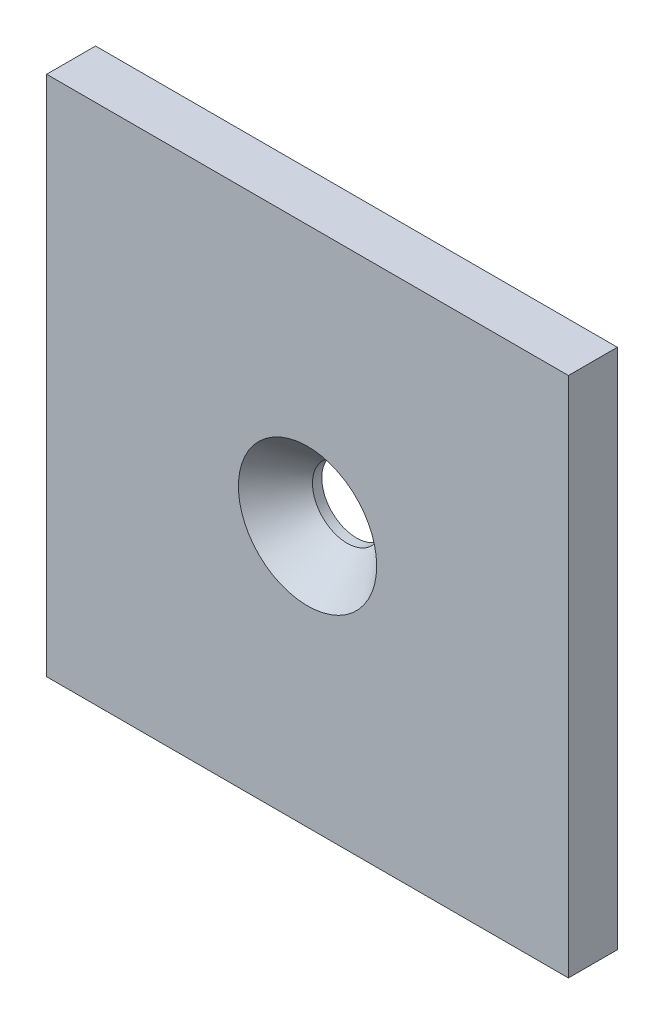
ISO-10303-21;
HEADER;
FILE_DESCRIPTION(('STEP AP214'),'2;1');
FILE_NAME('part.step','',(''),(''),'','','');
FILE_SCHEMA(('AUTOMOTIVE_DESIGN { 1 0 10303 214 1 1 1 1 }'));
ENDSEC;
DATA;
#1=APPLICATION_CONTEXT('core data for automotive mechanical design processes');
#2=APPLICATION_PROTOCOL_DEFINITION('international standard','automotive_design',2000,#1);
#3=PRODUCT_CONTEXT('',#1,'mechanical');
#4=PRODUCT('Part','Part','',(#3));
#5=PRODUCT_RELATED_PRODUCT_CATEGORY('part','',(#4));
#6=PRODUCT_DEFINITION_FORMATION('','',#4);
#7=PRODUCT_DEFINITION_CONTEXT('part definition',#1,'design');
#8=PRODUCT_DEFINITION('design','',#6,#7);
#9=PRODUCT_DEFINITION_SHAPE('','',#8);
#10=(LENGTH_UNIT() NAMED_UNIT(*) SI_UNIT(.MILLI.,.METRE.));
#11=(NAMED_UNIT(*) PLANE_ANGLE_UNIT() SI_UNIT($,.RADIAN.));
#12=(NAMED_UNIT(*) SI_UNIT($,.STERADIAN.) SOLID_ANGLE_UNIT());
#13=UNCERTAINTY_MEASURE_WITH_UNIT(LENGTH_MEASURE(1.E-05),#10,'distance_accuracy_value','');
#14=(GEOMETRIC_REPRESENTATION_CONTEXT(3) GLOBAL_UNCERTAINTY_ASSIGNED_CONTEXT((#13)) GLOBAL_UNIT_ASSIGNED_CONTEXT((#10,
#11,#12)) REPRESENTATION_CONTEXT('',''));
#15=CARTESIAN_POINT('',(0.,0.,0.));
#16=DIRECTION('',(0.,0.,1.));
#17=DIRECTION('',(1.,0.,0.));
#18=AXIS2_PLACEMENT_3D('',#15,#16,#17);
#19=CARTESIAN_POINT('',(0.,0.,4.7625));
#20=DIRECTION('',(1.,0.,0.));
#21=DIRECTION('',(0.,1.,0.));
#22=AXIS2_PLACEMENT_3D('',#19,#20,#21);
#23=PLANE('',#22);
#24=DIRECTION('',(0.,-1.,0.));
#25=VECTOR('',#24,1.);
#26=CARTESIAN_POINT('',(0.,0.,0.));
#27=LINE('',#26,#25);
#28=CARTESIAN_POINT('',(0.,0.,0.));
#29=VERTEX_POINT('',#28);
#30=CARTESIAN_POINT('',(0.,-50.8,0.));
#31=VERTEX_POINT('',#30);
#32=EDGE_CURVE('E111',#29,#31,#27,.T.);
#33=ORIENTED_EDGE('',*,*,#32,.T.);
#34=DIRECTION('',(0.,0.,-1.));
#35=VECTOR('',#34,1.);
#36=CARTESIAN_POINT('',(0.,-50.8,4.7625));
#37=LINE('',#36,#35);
#38=CARTESIAN_POINT('',(0.,-50.8,4.7625));
#39=VERTEX_POINT('',#38);
#40=EDGE_CURVE('E11',#39,#31,#37,.T.);
#41=ORIENTED_EDGE('',*,*,#40,.F.);
#42=DIRECTION('',(0.,-1.,0.));
#43=VECTOR('',#42,1.);
#44=CARTESIAN_POINT('',(0.,0.,4.7625));
#45=LINE('',#44,#43);
#46=CARTESIAN_POINT('',(0.,0.,4.7625));
#47=VERTEX_POINT('',#46);
#48=EDGE_CURVE('E95',#47,#39,#45,.T.);
#49=ORIENTED_EDGE('',*,*,#48,.F.);
#50=DIRECTION('',(0.,0.,-1.));
#51=VECTOR('',#50,1.);
#52=CARTESIAN_POINT('',(0.,0.,4.7625));
#53=LINE('',#52,#51);
#54=EDGE_CURVE('E107',#47,#29,#53,.T.);
#55=ORIENTED_EDGE('',*,*,#54,.T.);
#56=EDGE_LOOP('',(#33,#41,#49,#55));
#57=FACE_BOUND('',#56,.T.);
#58=ADVANCED_FACE('F43',(#57),#23,.F.);
#59=CARTESIAN_POINT('',(0.,-50.8,4.7625));
#60=DIRECTION('',(0.,1.,0.));
#61=DIRECTION('',(0.,0.,1.));
#62=AXIS2_PLACEMENT_3D('',#59,#60,#61);
#63=PLANE('',#62);
#64=DIRECTION('',(1.,0.,0.));
#65=VECTOR('',#64,1.);
#66=CARTESIAN_POINT('',(0.,-50.8,0.));
#67=LINE('',#66,#65);
#68=CARTESIAN_POINT('',(50.8,-50.8,0.));
#69=VERTEX_POINT('',#68);
#70=EDGE_CURVE('E100',#31,#69,#67,.T.);
#71=ORIENTED_EDGE('',*,*,#70,.T.);
#72=DIRECTION('',(0.,0.,-1.));
#73=VECTOR('',#72,1.);
#74=CARTESIAN_POINT('',(50.8,-50.8,4.7625));
#75=LINE('',#74,#73);
#76=CARTESIAN_POINT('',(50.8,-50.8,4.7625));
#77=VERTEX_POINT('',#76);
#78=EDGE_CURVE('E52',#77,#69,#75,.T.);
#79=ORIENTED_EDGE('',*,*,#78,.F.);
#80=DIRECTION('',(1.,0.,0.));
#81=VECTOR('',#80,1.);
#82=CARTESIAN_POINT('',(0.,-50.8,4.7625));
#83=LINE('',#82,#81);
#84=EDGE_CURVE('E90',#39,#77,#83,.T.);
#85=ORIENTED_EDGE('',*,*,#84,.F.);
#86=ORIENTED_EDGE('',*,*,#40,.T.);
#87=EDGE_LOOP('',(#71,#79,#85,#86));
#88=FACE_BOUND('',#87,.T.);
#89=ADVANCED_FACE('F99',(#88),#63,.F.);
#90=CARTESIAN_POINT('',(50.8,0.,4.7625));
#91=DIRECTION('',(-1.,0.,0.));
#92=DIRECTION('',(0.,-1.,0.));
#93=AXIS2_PLACEMENT_3D('',#90,#91,#92);
#94=PLANE('',#93);
#95=DIRECTION('',(0.,1.,0.));
#96=VECTOR('',#95,1.);
#97=CARTESIAN_POINT('',(50.8,0.,0.));
#98=LINE('',#97,#96);
#99=CARTESIAN_POINT('',(50.8,0.,0.));
#100=VERTEX_POINT('',#99);
#101=EDGE_CURVE('E77',#69,#100,#98,.T.);
#102=ORIENTED_EDGE('',*,*,#101,.T.);
#103=DIRECTION('',(0.,0.,-1.));
#104=VECTOR('',#103,1.);
#105=CARTESIAN_POINT('',(50.8,0.,4.7625));
#106=LINE('',#105,#104);
#107=CARTESIAN_POINT('',(50.8,0.,4.7625));
#108=VERTEX_POINT('',#107);
#109=EDGE_CURVE('E102',#108,#100,#106,.T.);
#110=ORIENTED_EDGE('',*,*,#109,.F.);
#111=DIRECTION('',(0.,1.,0.));
#112=VECTOR('',#111,1.);
#113=CARTESIAN_POINT('',(50.8,0.,4.7625));
#114=LINE('',#113,#112);
#115=EDGE_CURVE('E93',#77,#108,#114,.T.);
#116=ORIENTED_EDGE('',*,*,#115,.F.);
#117=ORIENTED_EDGE('',*,*,#78,.T.);
#118=EDGE_LOOP('',(#102,#110,#116,#117));
#119=FACE_BOUND('',#118,.T.);
#120=ADVANCED_FACE('F103',(#119),#94,.F.);
#121=CARTESIAN_POINT('',(0.,0.,4.7625));
#122=DIRECTION('',(0.,-1.,0.));
#123=DIRECTION('',(0.,0.,-1.));
#124=AXIS2_PLACEMENT_3D('',#121,#122,#123);
#125=PLANE('',#124);
#126=DIRECTION('',(-1.,0.,0.));
#127=VECTOR('',#126,1.);
#128=CARTESIAN_POINT('',(0.,0.,0.));
#129=LINE('',#128,#127);
#130=EDGE_CURVE('E83',#100,#29,#129,.T.);
#131=ORIENTED_EDGE('',*,*,#130,.T.);
#132=ORIENTED_EDGE('',*,*,#54,.F.);
#133=DIRECTION('',(-1.,0.,0.));
#134=VECTOR('',#133,1.);
#135=CARTESIAN_POINT('',(0.,0.,4.7625));
#136=LINE('',#135,#134);
#137=EDGE_CURVE('E60',#108,#47,#136,.T.);
#138=ORIENTED_EDGE('',*,*,#137,.F.);
#139=ORIENTED_EDGE('',*,*,#109,.T.);
#140=EDGE_LOOP('',(#131,#132,#138,#139));
#141=FACE_BOUND('',#140,.T.);
#142=ADVANCED_FACE('F125',(#141),#125,.F.);
#143=CARTESIAN_POINT('',(0.,0.,4.7625));
#144=DIRECTION('',(0.,0.,1.));
#145=DIRECTION('',(1.,0.,0.));
#146=AXIS2_PLACEMENT_3D('',#143,#144,#145);
#147=PLANE('',#146);
#148=CARTESIAN_POINT('',(25.4,-25.4,4.7625));
#149=DIRECTION('',(0.,0.,1.));
#150=DIRECTION('',(1.,0.,0.));
#151=AXIS2_PLACEMENT_3D('',#148,#149,#150);
#152=CIRCLE('',#151,6.731);
#153=CARTESIAN_POINT('',(32.131,-25.4,4.7625));
#154=VERTEX_POINT('',#153);
#155=EDGE_CURVE('E139',#154,#154,#152,.T.);
#156=ORIENTED_EDGE('',*,*,#155,.F.);
#157=EDGE_LOOP('',(#156));
#158=FACE_BOUND('',#157,.T.);
#159=ORIENTED_EDGE('',*,*,#48,.T.);
#160=ORIENTED_EDGE('',*,*,#84,.T.);
#161=ORIENTED_EDGE('',*,*,#115,.T.);
#162=ORIENTED_EDGE('',*,*,#137,.T.);
#163=EDGE_LOOP('',(#159,#160,#161,#162));
#164=FACE_BOUND('',#163,.T.);
#165=ADVANCED_FACE('F91',(#158,#164),#147,.T.);
#166=CARTESIAN_POINT('',(0.,0.,0.));
#167=DIRECTION('',(0.,0.,1.));
#168=DIRECTION('',(1.,0.,0.));
#169=AXIS2_PLACEMENT_3D('',#166,#167,#168);
#170=PLANE('',#169);
#171=CARTESIAN_POINT('',(25.4,-25.4,0.));
#172=DIRECTION('',(0.,0.,1.));
#173=DIRECTION('',(1.,0.,0.));
#174=AXIS2_PLACEMENT_3D('',#171,#172,#173);
#175=CIRCLE('',#174,3.3782);
#176=CARTESIAN_POINT('',(28.7782,-25.4,0.));
#177=VERTEX_POINT('',#176);
#178=EDGE_CURVE('E115',#177,#177,#175,.T.);
#179=ORIENTED_EDGE('',*,*,#178,.T.);
#180=EDGE_LOOP('',(#179));
#181=FACE_BOUND('',#180,.T.);
#182=ORIENTED_EDGE('',*,*,#32,.F.);
#183=ORIENTED_EDGE('',*,*,#130,.F.);
#184=ORIENTED_EDGE('',*,*,#101,.F.);
#185=ORIENTED_EDGE('',*,*,#70,.F.);
#186=EDGE_LOOP('',(#182,#183,#184,#185));
#187=FACE_BOUND('',#186,.T.);
#188=ADVANCED_FACE('F128',(#181,#187),#170,.F.);
#189=CARTESIAN_POINT('',(25.4,-25.4,4.7625));
#190=DIRECTION('',(0.,0.,1.));
#191=DIRECTION('',(1.,0.,0.));
#192=AXIS2_PLACEMENT_3D('',#189,#190,#191);
#193=CYLINDRICAL_SURFACE('',#192,3.3782);
#194=ORIENTED_EDGE('',*,*,#178,.F.);
#195=EDGE_LOOP('',(#194));
#196=FACE_BOUND('',#195,.T.);
#197=CARTESIAN_POINT('',(25.4,-25.4,0.905544804269415));
#198=DIRECTION('',(0.,0.,1.));
#199=DIRECTION('',(1.,0.,0.));
#200=AXIS2_PLACEMENT_3D('',#197,#198,#199);
#201=CIRCLE('',#200,3.3782);
#202=CARTESIAN_POINT('',(28.7782,-25.4,0.905544804269415));
#203=VERTEX_POINT('',#202);
#204=EDGE_CURVE('E135',#203,#203,#201,.T.);
#205=ORIENTED_EDGE('',*,*,#204,.T.);
#206=EDGE_LOOP('',(#205));
#207=FACE_BOUND('',#206,.T.);
#208=ADVANCED_FACE('F152',(#196,#207),#193,.F.);
#209=CARTESIAN_POINT('',(25.4,-25.4,4.7625));
#210=DIRECTION('',(0.,0.,1.));
#211=DIRECTION('',(1.,0.,0.));
#212=AXIS2_PLACEMENT_3D('',#209,#210,#211);
#213=CONICAL_SURFACE('',#212,6.731,0.715584993317678);
#214=ORIENTED_EDGE('',*,*,#204,.F.);
#215=EDGE_LOOP('',(#214));
#216=FACE_BOUND('',#215,.T.);
#217=ORIENTED_EDGE('',*,*,#155,.T.);
#218=EDGE_LOOP('',(#217));
#219=FACE_BOUND('',#218,.T.);
#220=ADVANCED_FACE('F144',(#216,#219),#213,.F.);
#221=CLOSED_SHELL('',(#58,#89,#120,#142,#165,#188,#208,#220));
#222=MANIFOLD_SOLID_BREP('B2',#221);
#223=ADVANCED_BREP_SHAPE_REPRESENTATION('',(#18,#222),#14);
#224=SHAPE_DEFINITION_REPRESENTATION(#9,#223);
ENDSEC;
END-ISO-10303-21;
